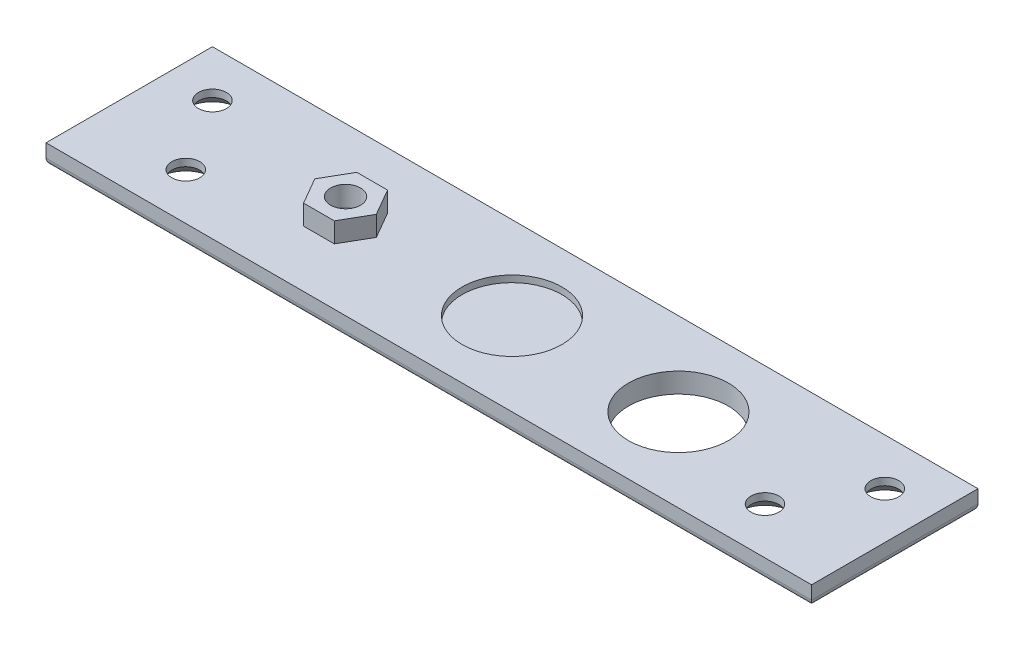
ISO-10303-21;
HEADER;
FILE_DESCRIPTION(('STEP AP214'),'2;1');
FILE_NAME('part.step','',(''),(''),'','','');
FILE_SCHEMA(('AUTOMOTIVE_DESIGN { 1 0 10303 214 1 1 1 1 }'));
ENDSEC;
DATA;
#1=APPLICATION_CONTEXT('core data for automotive mechanical design processes');
#2=APPLICATION_PROTOCOL_DEFINITION('international standard','automotive_design',2000,#1);
#3=PRODUCT_CONTEXT('',#1,'mechanical');
#4=PRODUCT('Part','Part','',(#3));
#5=PRODUCT_RELATED_PRODUCT_CATEGORY('part','',(#4));
#6=PRODUCT_DEFINITION_FORMATION('','',#4);
#7=PRODUCT_DEFINITION_CONTEXT('part definition',#1,'design');
#8=PRODUCT_DEFINITION('design','',#6,#7);
#9=PRODUCT_DEFINITION_SHAPE('','',#8);
#10=(LENGTH_UNIT() NAMED_UNIT(*) SI_UNIT(.MILLI.,.METRE.));
#11=(NAMED_UNIT(*) PLANE_ANGLE_UNIT() SI_UNIT($,.RADIAN.));
#12=(NAMED_UNIT(*) SI_UNIT($,.STERADIAN.) SOLID_ANGLE_UNIT());
#13=UNCERTAINTY_MEASURE_WITH_UNIT(LENGTH_MEASURE(1.E-05),#10,'distance_accuracy_value','');
#14=(GEOMETRIC_REPRESENTATION_CONTEXT(3) GLOBAL_UNCERTAINTY_ASSIGNED_CONTEXT((#13)) GLOBAL_UNIT_ASSIGNED_CONTEXT((#10,
#11,#12)) REPRESENTATION_CONTEXT('',''));
#15=CARTESIAN_POINT('',(0.,0.,0.));
#16=DIRECTION('',(0.,0.,1.));
#17=DIRECTION('',(1.,0.,0.));
#18=AXIS2_PLACEMENT_3D('',#15,#16,#17);
#19=CARTESIAN_POINT('',(0.,4.5,0.));
#20=DIRECTION('',(0.,1.,0.));
#21=DIRECTION('',(0.,0.,1.));
#22=AXIS2_PLACEMENT_3D('',#19,#20,#21);
#23=PLANE('',#22);
#24=DIRECTION('',(1.,0.,0.));
#25=VECTOR('',#24,1.);
#26=CARTESIAN_POINT('',(-27.3094010767585,4.5,3.99999999999999));
#27=LINE('',#26,#25);
#28=CARTESIAN_POINT('',(-27.3094010767585,4.5,3.99999999999999));
#29=VERTEX_POINT('',#28);
#30=CARTESIAN_POINT('',(-22.6905989232415,4.5,4.00000000000002));
#31=VERTEX_POINT('',#30);
#32=EDGE_CURVE('E145',#29,#31,#27,.T.);
#33=ORIENTED_EDGE('',*,*,#32,.T.);
#34=DIRECTION('',(0.500000000000006,0.,-0.866025403784435));
#35=VECTOR('',#34,1.);
#36=CARTESIAN_POINT('',(-22.6905989232415,4.5,4.00000000000002));
#37=LINE('',#36,#35);
#38=CARTESIAN_POINT('',(-20.381197846483,4.5,0.));
#39=VERTEX_POINT('',#38);
#40=EDGE_CURVE('E103',#31,#39,#37,.T.);
#41=ORIENTED_EDGE('',*,*,#40,.T.);
#42=DIRECTION('',(-0.499999999999993,0.,-0.866025403784442));
#43=VECTOR('',#42,1.);
#44=CARTESIAN_POINT('',(-20.381197846483,4.5,0.));
#45=LINE('',#44,#43);
#46=CARTESIAN_POINT('',(-22.6905989232415,4.5,-3.99999999999999));
#47=VERTEX_POINT('',#46);
#48=EDGE_CURVE('E116',#39,#47,#45,.T.);
#49=ORIENTED_EDGE('',*,*,#48,.T.);
#50=DIRECTION('',(-1.,0.,0.));
#51=VECTOR('',#50,1.);
#52=CARTESIAN_POINT('',(-22.6905989232415,4.5,-3.99999999999999));
#53=LINE('',#52,#51);
#54=CARTESIAN_POINT('',(-27.3094010767585,4.5,-4.00000000000002));
#55=VERTEX_POINT('',#54);
#56=EDGE_CURVE('E110',#47,#55,#53,.T.);
#57=ORIENTED_EDGE('',*,*,#56,.T.);
#58=DIRECTION('',(-0.500000000000007,0.,0.866025403784435));
#59=VECTOR('',#58,1.);
#60=CARTESIAN_POINT('',(-27.3094010767585,4.5,-4.00000000000002));
#61=LINE('',#60,#59);
#62=CARTESIAN_POINT('',(-29.618802153517,4.5,0.));
#63=VERTEX_POINT('',#62);
#64=EDGE_CURVE('E114',#55,#63,#61,.T.);
#65=ORIENTED_EDGE('',*,*,#64,.T.);
#66=DIRECTION('',(0.499999999999994,0.,0.866025403784442));
#67=VECTOR('',#66,1.);
#68=CARTESIAN_POINT('',(-29.618802153517,4.5,0.));
#69=LINE('',#68,#67);
#70=EDGE_CURVE('E66',#63,#29,#69,.T.);
#71=ORIENTED_EDGE('',*,*,#70,.T.);
#72=EDGE_LOOP('',(#33,#41,#49,#57,#65,#71));
#73=FACE_BOUND('',#72,.T.);
#74=CARTESIAN_POINT('',(-25.,4.5,0.));
#75=DIRECTION('',(0.,1.,0.));
#76=DIRECTION('',(0.,0.,1.));
#77=AXIS2_PLACEMENT_3D('',#74,#75,#76);
#78=CIRCLE('',#77,2.25);
#79=CARTESIAN_POINT('',(-25.,4.5,2.25));
#80=VERTEX_POINT('',#79);
#81=EDGE_CURVE('E138',#80,#80,#78,.T.);
#82=ORIENTED_EDGE('',*,*,#81,.F.);
#83=EDGE_LOOP('',(#82));
#84=FACE_BOUND('',#83,.T.);
#85=ADVANCED_FACE('F49',(#73,#84),#23,.T.);
#86=CARTESIAN_POINT('',(0.,1.5,0.));
#87=DIRECTION('',(0.,1.,0.));
#88=DIRECTION('',(0.,0.,1.));
#89=AXIS2_PLACEMENT_3D('',#86,#87,#88);
#90=PLANE('',#89);
#91=DIRECTION('',(1.,0.,0.));
#92=VECTOR('',#91,1.);
#93=CARTESIAN_POINT('',(-27.3094010767585,1.5,3.99999999999999));
#94=LINE('',#93,#92);
#95=CARTESIAN_POINT('',(-27.3094010767585,1.5,3.99999999999999));
#96=VERTEX_POINT('',#95);
#97=CARTESIAN_POINT('',(-22.6905989232415,1.5,4.00000000000002));
#98=VERTEX_POINT('',#97);
#99=EDGE_CURVE('E134',#96,#98,#94,.T.);
#100=ORIENTED_EDGE('',*,*,#99,.F.);
#101=DIRECTION('',(0.499999999999994,0.,0.866025403784442));
#102=VECTOR('',#101,1.);
#103=CARTESIAN_POINT('',(-29.618802153517,1.5,0.));
#104=LINE('',#103,#102);
#105=CARTESIAN_POINT('',(-29.618802153517,1.5,0.));
#106=VERTEX_POINT('',#105);
#107=EDGE_CURVE('E95',#106,#96,#104,.T.);
#108=ORIENTED_EDGE('',*,*,#107,.F.);
#109=DIRECTION('',(-0.500000000000007,0.,0.866025403784435));
#110=VECTOR('',#109,1.);
#111=CARTESIAN_POINT('',(-27.3094010767585,1.5,-4.00000000000002));
#112=LINE('',#111,#110);
#113=CARTESIAN_POINT('',(-27.3094010767585,1.5,-4.00000000000002));
#114=VERTEX_POINT('',#113);
#115=EDGE_CURVE('E89',#114,#106,#112,.T.);
#116=ORIENTED_EDGE('',*,*,#115,.F.);
#117=DIRECTION('',(-1.,0.,0.));
#118=VECTOR('',#117,1.);
#119=CARTESIAN_POINT('',(-22.6905989232415,1.5,-3.99999999999999));
#120=LINE('',#119,#118);
#121=CARTESIAN_POINT('',(-22.6905989232415,1.5,-3.99999999999999));
#122=VERTEX_POINT('',#121);
#123=EDGE_CURVE('E124',#122,#114,#120,.T.);
#124=ORIENTED_EDGE('',*,*,#123,.F.);
#125=DIRECTION('',(-0.499999999999993,0.,-0.866025403784442));
#126=VECTOR('',#125,1.);
#127=CARTESIAN_POINT('',(-20.381197846483,1.5,0.));
#128=LINE('',#127,#126);
#129=CARTESIAN_POINT('',(-20.381197846483,1.5,0.));
#130=VERTEX_POINT('',#129);
#131=EDGE_CURVE('E140',#130,#122,#128,.T.);
#132=ORIENTED_EDGE('',*,*,#131,.F.);
#133=DIRECTION('',(0.500000000000006,0.,-0.866025403784435));
#134=VECTOR('',#133,1.);
#135=CARTESIAN_POINT('',(-22.6905989232415,1.5,4.00000000000002));
#136=LINE('',#135,#134);
#137=EDGE_CURVE('E137',#98,#130,#136,.T.);
#138=ORIENTED_EDGE('',*,*,#137,.F.);
#139=EDGE_LOOP('',(#100,#108,#116,#124,#132,#138));
#140=FACE_BOUND('',#139,.T.);
#141=CARTESIAN_POINT('',(-25.,1.5,0.));
#142=DIRECTION('',(0.,1.,0.));
#143=DIRECTION('',(0.,0.,1.));
#144=AXIS2_PLACEMENT_3D('',#141,#142,#143);
#145=CIRCLE('',#144,2.25);
#146=CARTESIAN_POINT('',(-25.,1.5,2.25));
#147=VERTEX_POINT('',#146);
#148=EDGE_CURVE('E256',#147,#147,#145,.T.);
#149=ORIENTED_EDGE('',*,*,#148,.T.);
#150=EDGE_LOOP('',(#149));
#151=FACE_BOUND('',#150,.T.);
#152=ADVANCED_FACE('F154',(#140,#151),#90,.F.);
#153=CARTESIAN_POINT('',(-27.3094010767585,4.5,3.99999999999999));
#154=DIRECTION('',(0.,0.,-1.));
#155=DIRECTION('',(-1.,0.,0.));
#156=AXIS2_PLACEMENT_3D('',#153,#154,#155);
#157=PLANE('',#156);
#158=ORIENTED_EDGE('',*,*,#99,.T.);
#159=DIRECTION('',(0.,-1.,0.));
#160=VECTOR('',#159,1.);
#161=CARTESIAN_POINT('',(-22.6905989232415,4.5,4.00000000000002));
#162=LINE('',#161,#160);
#163=EDGE_CURVE('E12',#31,#98,#162,.T.);
#164=ORIENTED_EDGE('',*,*,#163,.F.);
#165=ORIENTED_EDGE('',*,*,#32,.F.);
#166=DIRECTION('',(0.,-1.,0.));
#167=VECTOR('',#166,1.);
#168=CARTESIAN_POINT('',(-27.3094010767585,4.5,3.99999999999999));
#169=LINE('',#168,#167);
#170=EDGE_CURVE('E130',#29,#96,#169,.T.);
#171=ORIENTED_EDGE('',*,*,#170,.T.);
#172=EDGE_LOOP('',(#158,#164,#165,#171));
#173=FACE_BOUND('',#172,.T.);
#174=ADVANCED_FACE('F51',(#173),#157,.F.);
#175=CARTESIAN_POINT('',(-22.6905989232415,4.5,4.00000000000002));
#176=DIRECTION('',(-0.866025403784435,0.,-0.500000000000006));
#177=DIRECTION('',(-0.500000000000006,0.,0.866025403784436));
#178=AXIS2_PLACEMENT_3D('',#175,#176,#177);
#179=PLANE('',#178);
#180=ORIENTED_EDGE('',*,*,#137,.T.);
#181=DIRECTION('',(0.,-1.,0.));
#182=VECTOR('',#181,1.);
#183=CARTESIAN_POINT('',(-20.381197846483,4.5,0.));
#184=LINE('',#183,#182);
#185=EDGE_CURVE('E58',#39,#130,#184,.T.);
#186=ORIENTED_EDGE('',*,*,#185,.F.);
#187=ORIENTED_EDGE('',*,*,#40,.F.);
#188=ORIENTED_EDGE('',*,*,#163,.T.);
#189=EDGE_LOOP('',(#180,#186,#187,#188));
#190=FACE_BOUND('',#189,.T.);
#191=ADVANCED_FACE('F179',(#190),#179,.F.);
#192=CARTESIAN_POINT('',(-20.381197846483,4.5,0.));
#193=DIRECTION('',(-0.866025403784442,0.,0.499999999999994));
#194=DIRECTION('',(0.499999999999994,0.,0.866025403784442));
#195=AXIS2_PLACEMENT_3D('',#192,#193,#194);
#196=PLANE('',#195);
#197=ORIENTED_EDGE('',*,*,#131,.T.);
#198=DIRECTION('',(0.,-1.,0.));
#199=VECTOR('',#198,1.);
#200=CARTESIAN_POINT('',(-22.6905989232415,4.5,-3.99999999999999));
#201=LINE('',#200,#199);
#202=EDGE_CURVE('E125',#47,#122,#201,.T.);
#203=ORIENTED_EDGE('',*,*,#202,.F.);
#204=ORIENTED_EDGE('',*,*,#48,.F.);
#205=ORIENTED_EDGE('',*,*,#185,.T.);
#206=EDGE_LOOP('',(#197,#203,#204,#205));
#207=FACE_BOUND('',#206,.T.);
#208=ADVANCED_FACE('F151',(#207),#196,.F.);
#209=CARTESIAN_POINT('',(-22.6905989232415,4.5,-3.99999999999999));
#210=DIRECTION('',(0.,0.,1.));
#211=DIRECTION('',(1.,0.,0.));
#212=AXIS2_PLACEMENT_3D('',#209,#210,#211);
#213=PLANE('',#212);
#214=ORIENTED_EDGE('',*,*,#123,.T.);
#215=DIRECTION('',(0.,-1.,0.));
#216=VECTOR('',#215,1.);
#217=CARTESIAN_POINT('',(-27.3094010767585,4.5,-4.00000000000002));
#218=LINE('',#217,#216);
#219=EDGE_CURVE('E121',#55,#114,#218,.T.);
#220=ORIENTED_EDGE('',*,*,#219,.F.);
#221=ORIENTED_EDGE('',*,*,#56,.F.);
#222=ORIENTED_EDGE('',*,*,#202,.T.);
#223=EDGE_LOOP('',(#214,#220,#221,#222));
#224=FACE_BOUND('',#223,.T.);
#225=ADVANCED_FACE('F122',(#224),#213,.F.);
#226=CARTESIAN_POINT('',(-27.3094010767585,4.5,-4.00000000000002));
#227=DIRECTION('',(0.866025403784435,0.,0.500000000000007));
#228=DIRECTION('',(0.500000000000007,0.,-0.866025403784435));
#229=AXIS2_PLACEMENT_3D('',#226,#227,#228);
#230=PLANE('',#229);
#231=ORIENTED_EDGE('',*,*,#115,.T.);
#232=DIRECTION('',(0.,-1.,0.));
#233=VECTOR('',#232,1.);
#234=CARTESIAN_POINT('',(-29.618802153517,4.5,0.));
#235=LINE('',#234,#233);
#236=EDGE_CURVE('E126',#63,#106,#235,.T.);
#237=ORIENTED_EDGE('',*,*,#236,.F.);
#238=ORIENTED_EDGE('',*,*,#64,.F.);
#239=ORIENTED_EDGE('',*,*,#219,.T.);
#240=EDGE_LOOP('',(#231,#237,#238,#239));
#241=FACE_BOUND('',#240,.T.);
#242=ADVANCED_FACE('F128',(#241),#230,.F.);
#243=CARTESIAN_POINT('',(-29.618802153517,4.5,0.));
#244=DIRECTION('',(0.866025403784442,0.,-0.499999999999994));
#245=DIRECTION('',(-0.499999999999994,0.,-0.866025403784442));
#246=AXIS2_PLACEMENT_3D('',#243,#244,#245);
#247=PLANE('',#246);
#248=ORIENTED_EDGE('',*,*,#107,.T.);
#249=ORIENTED_EDGE('',*,*,#170,.F.);
#250=ORIENTED_EDGE('',*,*,#70,.F.);
#251=ORIENTED_EDGE('',*,*,#236,.T.);
#252=EDGE_LOOP('',(#248,#249,#250,#251));
#253=FACE_BOUND('',#252,.T.);
#254=ADVANCED_FACE('F159',(#253),#247,.F.);
#255=CARTESIAN_POINT('',(-25.,4.5,0.));
#256=DIRECTION('',(0.,-1.,0.));
#257=DIRECTION('',(0.,0.,-1.));
#258=AXIS2_PLACEMENT_3D('',#255,#256,#257);
#259=CYLINDRICAL_SURFACE('',#258,2.25);
#260=ORIENTED_EDGE('',*,*,#81,.T.);
#261=EDGE_LOOP('',(#260));
#262=FACE_BOUND('',#261,.T.);
#263=ORIENTED_EDGE('',*,*,#148,.F.);
#264=EDGE_LOOP('',(#263));
#265=FACE_BOUND('',#264,.T.);
#266=ADVANCED_FACE('F161',(#262,#265),#259,.F.);
#267=CLOSED_SHELL('',(#85,#152,#174,#191,#208,#225,#242,#254,#266));
#268=MANIFOLD_SOLID_BREP('B2',#267);
#269=CARTESIAN_POINT('',(57.5,1.5,12.5));
#270=DIRECTION('',(-1.,0.,0.));
#271=DIRECTION('',(0.,0.,1.));
#272=AXIS2_PLACEMENT_3D('',#269,#270,#271);
#273=PLANE('',#272);
#274=DIRECTION('',(0.,-1.,0.));
#275=VECTOR('',#274,1.);
#276=CARTESIAN_POINT('',(57.5,1.5,12.5));
#277=LINE('',#276,#275);
#278=CARTESIAN_POINT('',(57.5,1.5,12.5));
#279=VERTEX_POINT('',#278);
#280=CARTESIAN_POINT('',(57.5,-0.5,12.5));
#281=VERTEX_POINT('',#280);
#282=EDGE_CURVE('E425',#279,#281,#277,.T.);
#283=ORIENTED_EDGE('',*,*,#282,.T.);
#284=DIRECTION('',(0.,0.,-1.));
#285=VECTOR('',#284,1.);
#286=CARTESIAN_POINT('',(57.5,-0.5,-12.5));
#287=LINE('',#286,#285);
#288=CARTESIAN_POINT('',(57.5,-0.5,-12.5));
#289=VERTEX_POINT('',#288);
#290=EDGE_CURVE('E272',#281,#289,#287,.T.);
#291=ORIENTED_EDGE('',*,*,#290,.T.);
#292=DIRECTION('',(0.,-1.,0.));
#293=VECTOR('',#292,1.);
#294=CARTESIAN_POINT('',(57.5,1.5,-12.5));
#295=LINE('',#294,#293);
#296=CARTESIAN_POINT('',(57.5,1.5,-12.5));
#297=VERTEX_POINT('',#296);
#298=EDGE_CURVE('E324',#297,#289,#295,.T.);
#299=ORIENTED_EDGE('',*,*,#298,.F.);
#300=DIRECTION('',(0.,0.,-1.));
#301=VECTOR('',#300,1.);
#302=CARTESIAN_POINT('',(57.5,1.5,12.5));
#303=LINE('',#302,#301);
#304=EDGE_CURVE('E330',#279,#297,#303,.T.);
#305=ORIENTED_EDGE('',*,*,#304,.F.);
#306=EDGE_LOOP('',(#283,#291,#299,#305));
#307=FACE_BOUND('',#306,.T.);
#308=ADVANCED_FACE('F263',(#307),#273,.F.);
#309=CARTESIAN_POINT('',(-57.5,1.5,-12.5));
#310=DIRECTION('',(0.,0.,1.));
#311=DIRECTION('',(1.,0.,0.));
#312=AXIS2_PLACEMENT_3D('',#309,#310,#311);
#313=PLANE('',#312);
#314=ORIENTED_EDGE('',*,*,#298,.T.);
#315=DIRECTION('',(-1.,0.,0.));
#316=VECTOR('',#315,1.);
#317=CARTESIAN_POINT('',(-57.5,-0.5,-12.5));
#318=LINE('',#317,#316);
#319=CARTESIAN_POINT('',(-57.5,-0.5,-12.5));
#320=VERTEX_POINT('',#319);
#321=EDGE_CURVE('E340',#289,#320,#318,.T.);
#322=ORIENTED_EDGE('',*,*,#321,.T.);
#323=DIRECTION('',(0.,-1.,0.));
#324=VECTOR('',#323,1.);
#325=CARTESIAN_POINT('',(-57.5,1.5,-12.5));
#326=LINE('',#325,#324);
#327=CARTESIAN_POINT('',(-57.5,1.5,-12.5));
#328=VERTEX_POINT('',#327);
#329=EDGE_CURVE('E326',#328,#320,#326,.T.);
#330=ORIENTED_EDGE('',*,*,#329,.F.);
#331=DIRECTION('',(-1.,0.,0.));
#332=VECTOR('',#331,1.);
#333=CARTESIAN_POINT('',(-57.5,1.5,-12.5));
#334=LINE('',#333,#332);
#335=EDGE_CURVE('E319',#297,#328,#334,.T.);
#336=ORIENTED_EDGE('',*,*,#335,.F.);
#337=EDGE_LOOP('',(#314,#322,#330,#336));
#338=FACE_BOUND('',#337,.T.);
#339=ADVANCED_FACE('F321',(#338),#313,.F.);
#340=CARTESIAN_POINT('',(-57.5,1.5,12.5));
#341=DIRECTION('',(1.,0.,0.));
#342=DIRECTION('',(0.,0.,-1.));
#343=AXIS2_PLACEMENT_3D('',#340,#341,#342);
#344=PLANE('',#343);
#345=ORIENTED_EDGE('',*,*,#329,.T.);
#346=DIRECTION('',(0.,0.,1.));
#347=VECTOR('',#346,1.);
#348=CARTESIAN_POINT('',(-57.5,-0.5,12.5));
#349=LINE('',#348,#347);
#350=CARTESIAN_POINT('',(-57.5,-0.5,12.5));
#351=VERTEX_POINT('',#350);
#352=EDGE_CURVE('E286',#320,#351,#349,.T.);
#353=ORIENTED_EDGE('',*,*,#352,.T.);
#354=DIRECTION('',(0.,-1.,0.));
#355=VECTOR('',#354,1.);
#356=CARTESIAN_POINT('',(-57.5,1.5,12.5));
#357=LINE('',#356,#355);
#358=CARTESIAN_POINT('',(-57.5,1.5,12.5));
#359=VERTEX_POINT('',#358);
#360=EDGE_CURVE('E344',#359,#351,#357,.T.);
#361=ORIENTED_EDGE('',*,*,#360,.F.);
#362=DIRECTION('',(0.,0.,1.));
#363=VECTOR('',#362,1.);
#364=CARTESIAN_POINT('',(-57.5,1.5,12.5));
#365=LINE('',#364,#363);
#366=EDGE_CURVE('E329',#328,#359,#365,.T.);
#367=ORIENTED_EDGE('',*,*,#366,.F.);
#368=EDGE_LOOP('',(#345,#353,#361,#367));
#369=FACE_BOUND('',#368,.T.);
#370=ADVANCED_FACE('F435',(#369),#344,.F.);
#371=CARTESIAN_POINT('',(-57.5,1.5,12.5));
#372=DIRECTION('',(0.,0.,-1.));
#373=DIRECTION('',(-1.,0.,0.));
#374=AXIS2_PLACEMENT_3D('',#371,#372,#373);
#375=PLANE('',#374);
#376=ORIENTED_EDGE('',*,*,#360,.T.);
#377=DIRECTION('',(1.,0.,0.));
#378=VECTOR('',#377,1.);
#379=CARTESIAN_POINT('',(57.5,-0.5,12.5));
#380=LINE('',#379,#378);
#381=EDGE_CURVE('E47',#351,#281,#380,.T.);
#382=ORIENTED_EDGE('',*,*,#381,.T.);
#383=ORIENTED_EDGE('',*,*,#282,.F.);
#384=DIRECTION('',(1.,0.,0.));
#385=VECTOR('',#384,1.);
#386=CARTESIAN_POINT('',(-57.5,1.5,12.5));
#387=LINE('',#386,#385);
#388=EDGE_CURVE('E335',#359,#279,#387,.T.);
#389=ORIENTED_EDGE('',*,*,#388,.F.);
#390=EDGE_LOOP('',(#376,#382,#383,#389));
#391=FACE_BOUND('',#390,.T.);
#392=ADVANCED_FACE('F426',(#391),#375,.F.);
#393=CARTESIAN_POINT('',(0.,1.5,0.));
#394=DIRECTION('',(0.,-1.,0.));
#395=DIRECTION('',(0.,0.,-1.));
#396=AXIS2_PLACEMENT_3D('',#393,#394,#395);
#397=PLANE('',#396);
#398=CARTESIAN_POINT('',(-25.,1.5,0.));
#399=DIRECTION('',(0.,-1.,0.));
#400=DIRECTION('',(0.,0.,-1.));
#401=AXIS2_PLACEMENT_3D('',#398,#399,#400);
#402=CIRCLE('',#401,2.25);
#403=CARTESIAN_POINT('',(-25.,1.5,-2.25));
#404=VERTEX_POINT('',#403);
#405=EDGE_CURVE('E361',#404,#404,#402,.T.);
#406=ORIENTED_EDGE('',*,*,#405,.T.);
#407=EDGE_LOOP('',(#406));
#408=FACE_BOUND('',#407,.T.);
#409=CARTESIAN_POINT('',(50.5,1.5,-5.5));
#410=DIRECTION('',(0.,-1.,0.));
#411=DIRECTION('',(0.,0.,-1.));
#412=AXIS2_PLACEMENT_3D('',#409,#410,#411);
#413=CIRCLE('',#412,2.1);
#414=CARTESIAN_POINT('',(50.5,1.5,-7.6));
#415=VERTEX_POINT('',#414);
#416=EDGE_CURVE('E378',#415,#415,#413,.T.);
#417=ORIENTED_EDGE('',*,*,#416,.T.);
#418=EDGE_LOOP('',(#417));
#419=FACE_BOUND('',#418,.T.);
#420=CARTESIAN_POINT('',(43.5,1.5,5.5));
#421=DIRECTION('',(0.,-1.,0.));
#422=DIRECTION('',(0.,0.,-1.));
#423=AXIS2_PLACEMENT_3D('',#420,#421,#422);
#424=CIRCLE('',#423,2.1);
#425=CARTESIAN_POINT('',(43.5,1.5,3.4));
#426=VERTEX_POINT('',#425);
#427=EDGE_CURVE('E391',#426,#426,#424,.T.);
#428=ORIENTED_EDGE('',*,*,#427,.T.);
#429=EDGE_LOOP('',(#428));
#430=FACE_BOUND('',#429,.T.);
#431=CARTESIAN_POINT('',(-43.5,1.5,5.5));
#432=DIRECTION('',(0.,-1.,0.));
#433=DIRECTION('',(0.,0.,-1.));
#434=AXIS2_PLACEMENT_3D('',#431,#432,#433);
#435=CIRCLE('',#434,2.1);
#436=CARTESIAN_POINT('',(-43.5,1.5,3.4));
#437=VERTEX_POINT('',#436);
#438=EDGE_CURVE('E400',#437,#437,#435,.T.);
#439=ORIENTED_EDGE('',*,*,#438,.T.);
#440=EDGE_LOOP('',(#439));
#441=FACE_BOUND('',#440,.T.);
#442=CARTESIAN_POINT('',(-50.5,1.5,-5.5));
#443=DIRECTION('',(0.,-1.,0.));
#444=DIRECTION('',(0.,0.,-1.));
#445=AXIS2_PLACEMENT_3D('',#442,#443,#444);
#446=CIRCLE('',#445,2.1);
#447=CARTESIAN_POINT('',(-50.5,1.5,-7.6));
#448=VERTEX_POINT('',#447);
#449=EDGE_CURVE('E409',#448,#448,#446,.T.);
#450=ORIENTED_EDGE('',*,*,#449,.T.);
#451=EDGE_LOOP('',(#450));
#452=FACE_BOUND('',#451,.T.);
#453=CARTESIAN_POINT('',(0.,1.5,0.));
#454=DIRECTION('',(0.,1.,0.));
#455=DIRECTION('',(0.,0.,1.));
#456=AXIS2_PLACEMENT_3D('',#453,#454,#455);
#457=CIRCLE('',#456,7.5);
#458=CARTESIAN_POINT('',(0.,1.5,7.5));
#459=VERTEX_POINT('',#458);
#460=EDGE_CURVE('E412',#459,#459,#457,.T.);
#461=ORIENTED_EDGE('',*,*,#460,.F.);
#462=EDGE_LOOP('',(#461));
#463=FACE_BOUND('',#462,.T.);
#464=CARTESIAN_POINT('',(25.,1.5,0.));
#465=DIRECTION('',(0.,1.,0.));
#466=DIRECTION('',(0.,0.,1.));
#467=AXIS2_PLACEMENT_3D('',#464,#465,#466);
#468=CIRCLE('',#467,7.5);
#469=CARTESIAN_POINT('',(25.,1.5,7.5));
#470=VERTEX_POINT('',#469);
#471=EDGE_CURVE('E416',#470,#470,#468,.T.);
#472=ORIENTED_EDGE('',*,*,#471,.F.);
#473=EDGE_LOOP('',(#472));
#474=FACE_BOUND('',#473,.T.);
#475=ORIENTED_EDGE('',*,*,#304,.T.);
#476=ORIENTED_EDGE('',*,*,#335,.T.);
#477=ORIENTED_EDGE('',*,*,#366,.T.);
#478=ORIENTED_EDGE('',*,*,#388,.T.);
#479=EDGE_LOOP('',(#475,#476,#477,#478));
#480=FACE_BOUND('',#479,.T.);
#481=ADVANCED_FACE('F333',(#408,#419,#430,#441,#452,#463,#474,#480),#397,.F.);
#482=CARTESIAN_POINT('',(0.,-1.5,0.));
#483=DIRECTION('',(0.,-1.,0.));
#484=DIRECTION('',(0.,0.,-1.));
#485=AXIS2_PLACEMENT_3D('',#482,#483,#484);
#486=PLANE('',#485);
#487=CARTESIAN_POINT('',(-25.,-1.5,0.));
#488=DIRECTION('',(0.,-1.,0.));
#489=DIRECTION('',(0.,0.,-1.));
#490=AXIS2_PLACEMENT_3D('',#487,#488,#489);
#491=CIRCLE('',#490,4.48);
#492=CARTESIAN_POINT('',(-25.,-1.5,-4.48));
#493=VERTEX_POINT('',#492);
#494=EDGE_CURVE('E522',#493,#493,#491,.T.);
#495=ORIENTED_EDGE('',*,*,#494,.F.);
#496=EDGE_LOOP('',(#495));
#497=FACE_BOUND('',#496,.T.);
#498=DIRECTION('',(0.,0.,1.));
#499=VECTOR('',#498,1.);
#500=CARTESIAN_POINT('',(-56.5,-1.5,-12.5));
#501=LINE('',#500,#499);
#502=CARTESIAN_POINT('',(-56.5,-1.5,11.5));
#503=VERTEX_POINT('',#502);
#504=CARTESIAN_POINT('',(-56.5,-1.5,-11.5));
#505=VERTEX_POINT('',#504);
#506=EDGE_CURVE('E351',#503,#505,#501,.F.);
#507=ORIENTED_EDGE('',*,*,#506,.T.);
#508=DIRECTION('',(-1.,0.,0.));
#509=VECTOR('',#508,1.);
#510=CARTESIAN_POINT('',(57.5,-1.5,-11.5));
#511=LINE('',#510,#509);
#512=CARTESIAN_POINT('',(56.5,-1.5,-11.5));
#513=VERTEX_POINT('',#512);
#514=EDGE_CURVE('E353',#505,#513,#511,.F.);
#515=ORIENTED_EDGE('',*,*,#514,.T.);
#516=DIRECTION('',(0.,0.,-1.));
#517=VECTOR('',#516,1.);
#518=CARTESIAN_POINT('',(56.5,-1.5,12.5));
#519=LINE('',#518,#517);
#520=CARTESIAN_POINT('',(56.5,-1.5,11.5));
#521=VERTEX_POINT('',#520);
#522=EDGE_CURVE('E349',#513,#521,#519,.F.);
#523=ORIENTED_EDGE('',*,*,#522,.T.);
#524=DIRECTION('',(1.,0.,0.));
#525=VECTOR('',#524,1.);
#526=CARTESIAN_POINT('',(-57.5,-1.5,11.5));
#527=LINE('',#526,#525);
#528=EDGE_CURVE('E342',#521,#503,#527,.F.);
#529=ORIENTED_EDGE('',*,*,#528,.T.);
#530=EDGE_LOOP('',(#507,#515,#523,#529));
#531=FACE_BOUND('',#530,.T.);
#532=CARTESIAN_POINT('',(50.5,-1.5,-5.5));
#533=DIRECTION('',(0.,-1.,0.));
#534=DIRECTION('',(0.,0.,-1.));
#535=AXIS2_PLACEMENT_3D('',#532,#533,#534);
#536=CIRCLE('',#535,4.);
#537=CARTESIAN_POINT('',(50.5,-1.5,-9.5));
#538=VERTEX_POINT('',#537);
#539=EDGE_CURVE('E368',#538,#538,#536,.T.);
#540=ORIENTED_EDGE('',*,*,#539,.F.);
#541=EDGE_LOOP('',(#540));
#542=FACE_BOUND('',#541,.T.);
#543=CARTESIAN_POINT('',(43.5,-1.5,5.5));
#544=DIRECTION('',(0.,-1.,0.));
#545=DIRECTION('',(0.,0.,-1.));
#546=AXIS2_PLACEMENT_3D('',#543,#544,#545);
#547=CIRCLE('',#546,4.);
#548=CARTESIAN_POINT('',(43.5,-1.5,1.5));
#549=VERTEX_POINT('',#548);
#550=EDGE_CURVE('E385',#549,#549,#547,.T.);
#551=ORIENTED_EDGE('',*,*,#550,.F.);
#552=EDGE_LOOP('',(#551));
#553=FACE_BOUND('',#552,.T.);
#554=CARTESIAN_POINT('',(-43.5,-1.5,5.5));
#555=DIRECTION('',(0.,-1.,0.));
#556=DIRECTION('',(0.,0.,-1.));
#557=AXIS2_PLACEMENT_3D('',#554,#555,#556);
#558=CIRCLE('',#557,4.);
#559=CARTESIAN_POINT('',(-43.5,-1.5,1.5));
#560=VERTEX_POINT('',#559);
#561=EDGE_CURVE('E394',#560,#560,#558,.T.);
#562=ORIENTED_EDGE('',*,*,#561,.F.);
#563=EDGE_LOOP('',(#562));
#564=FACE_BOUND('',#563,.T.);
#565=CARTESIAN_POINT('',(-50.5,-1.5,-5.5));
#566=DIRECTION('',(0.,-1.,0.));
#567=DIRECTION('',(0.,0.,-1.));
#568=AXIS2_PLACEMENT_3D('',#565,#566,#567);
#569=CIRCLE('',#568,4.);
#570=CARTESIAN_POINT('',(-50.5,-1.5,-9.5));
#571=VERTEX_POINT('',#570);
#572=EDGE_CURVE('E403',#571,#571,#569,.T.);
#573=ORIENTED_EDGE('',*,*,#572,.F.);
#574=EDGE_LOOP('',(#573));
#575=FACE_BOUND('',#574,.T.);
#576=CARTESIAN_POINT('',(25.,-1.5,0.));
#577=DIRECTION('',(0.,1.,0.));
#578=DIRECTION('',(0.,0.,1.));
#579=AXIS2_PLACEMENT_3D('',#576,#577,#578);
#580=CIRCLE('',#579,7.5);
#581=CARTESIAN_POINT('',(25.,-1.5,7.5));
#582=VERTEX_POINT('',#581);
#583=EDGE_CURVE('E337',#582,#582,#580,.T.);
#584=ORIENTED_EDGE('',*,*,#583,.T.);
#585=EDGE_LOOP('',(#584));
#586=FACE_BOUND('',#585,.T.);
#587=ADVANCED_FACE('F509',(#497,#531,#542,#553,#564,#575,#586),#486,.T.);
#588=CARTESIAN_POINT('',(25.,-1.5,0.));
#589=DIRECTION('',(0.,1.,0.));
#590=DIRECTION('',(0.,0.,1.));
#591=AXIS2_PLACEMENT_3D('',#588,#589,#590);
#592=CYLINDRICAL_SURFACE('',#591,7.5);
#593=ORIENTED_EDGE('',*,*,#583,.F.);
#594=EDGE_LOOP('',(#593));
#595=FACE_BOUND('',#594,.T.);
#596=ORIENTED_EDGE('',*,*,#471,.T.);
#597=EDGE_LOOP('',(#596));
#598=FACE_BOUND('',#597,.T.);
#599=ADVANCED_FACE('F505',(#595,#598),#592,.F.);
#600=CARTESIAN_POINT('',(0.,0.5,0.));
#601=DIRECTION('',(0.,1.,0.));
#602=DIRECTION('',(0.,0.,1.));
#603=AXIS2_PLACEMENT_3D('',#600,#601,#602);
#604=CYLINDRICAL_SURFACE('',#603,7.5);
#605=CARTESIAN_POINT('',(0.,0.5,0.));
#606=DIRECTION('',(0.,1.,0.));
#607=DIRECTION('',(0.,0.,1.));
#608=AXIS2_PLACEMENT_3D('',#605,#606,#607);
#609=CIRCLE('',#608,7.5);
#610=CARTESIAN_POINT('',(0.,0.5,7.5));
#611=VERTEX_POINT('',#610);
#612=EDGE_CURVE('E413',#611,#611,#609,.T.);
#613=ORIENTED_EDGE('',*,*,#612,.F.);
#614=EDGE_LOOP('',(#613));
#615=FACE_BOUND('',#614,.T.);
#616=ORIENTED_EDGE('',*,*,#460,.T.);
#617=EDGE_LOOP('',(#616));
#618=FACE_BOUND('',#617,.T.);
#619=ADVANCED_FACE('F501',(#615,#618),#604,.F.);
#620=CARTESIAN_POINT('',(0.,0.5,0.));
#621=DIRECTION('',(0.,1.,0.));
#622=DIRECTION('',(0.,0.,1.));
#623=AXIS2_PLACEMENT_3D('',#620,#621,#622);
#624=PLANE('',#623);
#625=ORIENTED_EDGE('',*,*,#612,.T.);
#626=EDGE_LOOP('',(#625));
#627=FACE_BOUND('',#626,.T.);
#628=ADVANCED_FACE('F497',(#627),#624,.T.);
#629=CARTESIAN_POINT('',(-50.5,-1.5,-5.5));
#630=DIRECTION('',(0.,-1.,0.));
#631=DIRECTION('',(0.,0.,-1.));
#632=AXIS2_PLACEMENT_3D('',#629,#630,#631);
#633=CYLINDRICAL_SURFACE('',#632,2.1);
#634=ORIENTED_EDGE('',*,*,#449,.F.);
#635=EDGE_LOOP('',(#634));
#636=FACE_BOUND('',#635,.T.);
#637=CARTESIAN_POINT('',(-50.5,0.399999999999999,-5.5));
#638=DIRECTION('',(0.,-1.,0.));
#639=DIRECTION('',(0.,0.,-1.));
#640=AXIS2_PLACEMENT_3D('',#637,#638,#639);
#641=CIRCLE('',#640,2.1);
#642=CARTESIAN_POINT('',(-50.5,0.399999999999999,-7.6));
#643=VERTEX_POINT('',#642);
#644=EDGE_CURVE('E406',#643,#643,#641,.T.);
#645=ORIENTED_EDGE('',*,*,#644,.T.);
#646=EDGE_LOOP('',(#645));
#647=FACE_BOUND('',#646,.T.);
#648=ADVANCED_FACE('F493',(#636,#647),#633,.F.);
#649=CARTESIAN_POINT('',(-50.5,-1.5,-5.5));
#650=DIRECTION('',(0.,-1.,0.));
#651=DIRECTION('',(0.,0.,-1.));
#652=AXIS2_PLACEMENT_3D('',#649,#650,#651);
#653=CONICAL_SURFACE('',#652,4.,0.785398163397448);
#654=ORIENTED_EDGE('',*,*,#644,.F.);
#655=EDGE_LOOP('',(#654));
#656=FACE_BOUND('',#655,.T.);
#657=ORIENTED_EDGE('',*,*,#572,.T.);
#658=EDGE_LOOP('',(#657));
#659=FACE_BOUND('',#658,.T.);
#660=ADVANCED_FACE('F489',(#656,#659),#653,.F.);
#661=CARTESIAN_POINT('',(-43.5,-1.5,5.5));
#662=DIRECTION('',(0.,-1.,0.));
#663=DIRECTION('',(0.,0.,-1.));
#664=AXIS2_PLACEMENT_3D('',#661,#662,#663);
#665=CYLINDRICAL_SURFACE('',#664,2.1);
#666=ORIENTED_EDGE('',*,*,#438,.F.);
#667=EDGE_LOOP('',(#666));
#668=FACE_BOUND('',#667,.T.);
#669=CARTESIAN_POINT('',(-43.5,0.399999999999999,5.5));
#670=DIRECTION('',(0.,-1.,0.));
#671=DIRECTION('',(0.,0.,-1.));
#672=AXIS2_PLACEMENT_3D('',#669,#670,#671);
#673=CIRCLE('',#672,2.1);
#674=CARTESIAN_POINT('',(-43.5,0.399999999999999,3.4));
#675=VERTEX_POINT('',#674);
#676=EDGE_CURVE('E397',#675,#675,#673,.T.);
#677=ORIENTED_EDGE('',*,*,#676,.T.);
#678=EDGE_LOOP('',(#677));
#679=FACE_BOUND('',#678,.T.);
#680=ADVANCED_FACE('F485',(#668,#679),#665,.F.);
#681=CARTESIAN_POINT('',(-43.5,-1.5,5.5));
#682=DIRECTION('',(0.,-1.,0.));
#683=DIRECTION('',(0.,0.,-1.));
#684=AXIS2_PLACEMENT_3D('',#681,#682,#683);
#685=CONICAL_SURFACE('',#684,4.,0.78539816339745);
#686=ORIENTED_EDGE('',*,*,#676,.F.);
#687=EDGE_LOOP('',(#686));
#688=FACE_BOUND('',#687,.T.);
#689=ORIENTED_EDGE('',*,*,#561,.T.);
#690=EDGE_LOOP('',(#689));
#691=FACE_BOUND('',#690,.T.);
#692=ADVANCED_FACE('F481',(#688,#691),#685,.F.);
#693=CARTESIAN_POINT('',(43.5,-1.5,5.5));
#694=DIRECTION('',(0.,-1.,0.));
#695=DIRECTION('',(0.,0.,-1.));
#696=AXIS2_PLACEMENT_3D('',#693,#694,#695);
#697=CYLINDRICAL_SURFACE('',#696,2.1);
#698=ORIENTED_EDGE('',*,*,#427,.F.);
#699=EDGE_LOOP('',(#698));
#700=FACE_BOUND('',#699,.T.);
#701=CARTESIAN_POINT('',(43.5,0.399999999999999,5.5));
#702=DIRECTION('',(0.,-1.,0.));
#703=DIRECTION('',(0.,0.,-1.));
#704=AXIS2_PLACEMENT_3D('',#701,#702,#703);
#705=CIRCLE('',#704,2.1);
#706=CARTESIAN_POINT('',(43.5,0.399999999999999,3.4));
#707=VERTEX_POINT('',#706);
#708=EDGE_CURVE('E388',#707,#707,#705,.T.);
#709=ORIENTED_EDGE('',*,*,#708,.T.);
#710=EDGE_LOOP('',(#709));
#711=FACE_BOUND('',#710,.T.);
#712=ADVANCED_FACE('F477',(#700,#711),#697,.F.);
#713=CARTESIAN_POINT('',(43.5,-1.5,5.5));
#714=DIRECTION('',(0.,-1.,0.));
#715=DIRECTION('',(0.,0.,-1.));
#716=AXIS2_PLACEMENT_3D('',#713,#714,#715);
#717=CONICAL_SURFACE('',#716,4.,0.78539816339745);
#718=ORIENTED_EDGE('',*,*,#708,.F.);
#719=EDGE_LOOP('',(#718));
#720=FACE_BOUND('',#719,.T.);
#721=ORIENTED_EDGE('',*,*,#550,.T.);
#722=EDGE_LOOP('',(#721));
#723=FACE_BOUND('',#722,.T.);
#724=ADVANCED_FACE('F468',(#720,#723),#717,.F.);
#725=CARTESIAN_POINT('',(50.5,-1.5,-5.5));
#726=DIRECTION('',(0.,-1.,0.));
#727=DIRECTION('',(0.,0.,-1.));
#728=AXIS2_PLACEMENT_3D('',#725,#726,#727);
#729=CYLINDRICAL_SURFACE('',#728,2.1);
#730=ORIENTED_EDGE('',*,*,#416,.F.);
#731=EDGE_LOOP('',(#730));
#732=FACE_BOUND('',#731,.T.);
#733=CARTESIAN_POINT('',(50.5,0.399999999999999,-5.5));
#734=DIRECTION('',(0.,-1.,0.));
#735=DIRECTION('',(0.,0.,-1.));
#736=AXIS2_PLACEMENT_3D('',#733,#734,#735);
#737=CIRCLE('',#736,2.1);
#738=CARTESIAN_POINT('',(50.5,0.399999999999999,-7.6));
#739=VERTEX_POINT('',#738);
#740=EDGE_CURVE('E373',#739,#739,#737,.T.);
#741=ORIENTED_EDGE('',*,*,#740,.T.);
#742=EDGE_LOOP('',(#741));
#743=FACE_BOUND('',#742,.T.);
#744=ADVANCED_FACE('F463',(#732,#743),#729,.F.);
#745=CARTESIAN_POINT('',(50.5,-1.5,-5.5));
#746=DIRECTION('',(0.,-1.,0.));
#747=DIRECTION('',(0.,0.,-1.));
#748=AXIS2_PLACEMENT_3D('',#745,#746,#747);
#749=CONICAL_SURFACE('',#748,4.,0.785398163397448);
#750=ORIENTED_EDGE('',*,*,#740,.F.);
#751=EDGE_LOOP('',(#750));
#752=FACE_BOUND('',#751,.T.);
#753=ORIENTED_EDGE('',*,*,#539,.T.);
#754=EDGE_LOOP('',(#753));
#755=FACE_BOUND('',#754,.T.);
#756=ADVANCED_FACE('F459',(#752,#755),#749,.F.);
#757=CARTESIAN_POINT('',(-57.5,-0.5,11.5));
#758=DIRECTION('',(-1.,0.,0.));
#759=DIRECTION('',(0.,0.,1.));
#760=AXIS2_PLACEMENT_3D('',#757,#758,#759);
#761=CYLINDRICAL_SURFACE('',#760,1.);
#762=CARTESIAN_POINT('',(-56.5,-0.5,11.5));
#763=DIRECTION('',(-0.707106781186547,0.,-0.707106781186547));
#764=DIRECTION('',(-0.707106781186547,0.,0.707106781186547));
#765=AXIS2_PLACEMENT_3D('',#762,#763,#764);
#766=ELLIPSE('',#765,1.41421356237309,1.);
#767=EDGE_CURVE('E362',#503,#351,#766,.T.);
#768=ORIENTED_EDGE('',*,*,#767,.F.);
#769=ORIENTED_EDGE('',*,*,#528,.F.);
#770=CARTESIAN_POINT('',(56.5,-0.5,11.5));
#771=DIRECTION('',(-0.707106781186547,0.,0.707106781186547));
#772=DIRECTION('',(-0.707106781186547,0.,-0.707106781186547));
#773=AXIS2_PLACEMENT_3D('',#770,#771,#772);
#774=ELLIPSE('',#773,1.41421356237309,1.);
#775=EDGE_CURVE('E267',#281,#521,#774,.F.);
#776=ORIENTED_EDGE('',*,*,#775,.F.);
#777=ORIENTED_EDGE('',*,*,#381,.F.);
#778=EDGE_LOOP('',(#768,#769,#776,#777));
#779=FACE_BOUND('',#778,.T.);
#780=ADVANCED_FACE('F265',(#779),#761,.T.);
#781=CARTESIAN_POINT('',(56.5,-0.5,12.5));
#782=DIRECTION('',(0.,0.,1.));
#783=DIRECTION('',(1.,0.,0.));
#784=AXIS2_PLACEMENT_3D('',#781,#782,#783);
#785=CYLINDRICAL_SURFACE('',#784,1.);
#786=ORIENTED_EDGE('',*,*,#775,.T.);
#787=ORIENTED_EDGE('',*,*,#522,.F.);
#788=CARTESIAN_POINT('',(56.5,-0.5,-11.5));
#789=DIRECTION('',(0.707106781186547,0.,0.707106781186547));
#790=DIRECTION('',(-0.707106781186547,0.,0.707106781186547));
#791=AXIS2_PLACEMENT_3D('',#788,#789,#790);
#792=ELLIPSE('',#791,1.41421356237309,1.);
#793=EDGE_CURVE('E360',#289,#513,#792,.F.);
#794=ORIENTED_EDGE('',*,*,#793,.F.);
#795=ORIENTED_EDGE('',*,*,#290,.F.);
#796=EDGE_LOOP('',(#786,#787,#794,#795));
#797=FACE_BOUND('',#796,.T.);
#798=ADVANCED_FACE('F429',(#797),#785,.T.);
#799=CARTESIAN_POINT('',(-56.5,-0.5,12.5));
#800=DIRECTION('',(0.,0.,-1.));
#801=DIRECTION('',(-1.,0.,0.));
#802=AXIS2_PLACEMENT_3D('',#799,#800,#801);
#803=CYLINDRICAL_SURFACE('',#802,1.);
#804=ORIENTED_EDGE('',*,*,#767,.T.);
#805=ORIENTED_EDGE('',*,*,#352,.F.);
#806=CARTESIAN_POINT('',(-56.5,-0.5,-11.5));
#807=DIRECTION('',(0.707106781186547,0.,-0.707106781186547));
#808=DIRECTION('',(-0.707106781186547,0.,-0.707106781186547));
#809=AXIS2_PLACEMENT_3D('',#806,#807,#808);
#810=ELLIPSE('',#809,1.41421356237309,1.);
#811=EDGE_CURVE('E358',#505,#320,#810,.T.);
#812=ORIENTED_EDGE('',*,*,#811,.F.);
#813=ORIENTED_EDGE('',*,*,#506,.F.);
#814=EDGE_LOOP('',(#804,#805,#812,#813));
#815=FACE_BOUND('',#814,.T.);
#816=ADVANCED_FACE('F453',(#815),#803,.T.);
#817=CARTESIAN_POINT('',(-57.5,-0.5,-11.5));
#818=DIRECTION('',(1.,0.,0.));
#819=DIRECTION('',(0.,0.,-1.));
#820=AXIS2_PLACEMENT_3D('',#817,#818,#819);
#821=CYLINDRICAL_SURFACE('',#820,1.);
#822=ORIENTED_EDGE('',*,*,#793,.T.);
#823=ORIENTED_EDGE('',*,*,#514,.F.);
#824=ORIENTED_EDGE('',*,*,#811,.T.);
#825=ORIENTED_EDGE('',*,*,#321,.F.);
#826=EDGE_LOOP('',(#822,#823,#824,#825));
#827=FACE_BOUND('',#826,.T.);
#828=ADVANCED_FACE('F433',(#827),#821,.T.);
#829=CARTESIAN_POINT('',(-25.,-1.5,0.));
#830=DIRECTION('',(0.,-1.,0.));
#831=DIRECTION('',(0.,0.,-1.));
#832=AXIS2_PLACEMENT_3D('',#829,#830,#831);
#833=CYLINDRICAL_SURFACE('',#832,2.25);
#834=ORIENTED_EDGE('',*,*,#405,.F.);
#835=EDGE_LOOP('',(#834));
#836=FACE_BOUND('',#835,.T.);
#837=CARTESIAN_POINT('',(-25.,0.73,0.));
#838=DIRECTION('',(0.,-1.,0.));
#839=DIRECTION('',(0.,0.,-1.));
#840=AXIS2_PLACEMENT_3D('',#837,#838,#839);
#841=CIRCLE('',#840,2.25);
#842=CARTESIAN_POINT('',(-25.,0.73,-2.25));
#843=VERTEX_POINT('',#842);
#844=EDGE_CURVE('E539',#843,#843,#841,.T.);
#845=ORIENTED_EDGE('',*,*,#844,.T.);
#846=EDGE_LOOP('',(#845));
#847=FACE_BOUND('',#846,.T.);
#848=ADVANCED_FACE('F452',(#836,#847),#833,.F.);
#849=CARTESIAN_POINT('',(-25.,-1.5,0.));
#850=DIRECTION('',(0.,-1.,0.));
#851=DIRECTION('',(0.,0.,-1.));
#852=AXIS2_PLACEMENT_3D('',#849,#850,#851);
#853=CONICAL_SURFACE('',#852,4.48,0.785398163397448);
#854=ORIENTED_EDGE('',*,*,#844,.F.);
#855=EDGE_LOOP('',(#854));
#856=FACE_BOUND('',#855,.T.);
#857=ORIENTED_EDGE('',*,*,#494,.T.);
#858=EDGE_LOOP('',(#857));
#859=FACE_BOUND('',#858,.T.);
#860=ADVANCED_FACE('F549',(#856,#859),#853,.F.);
#861=CLOSED_SHELL('',(#308,#339,#370,#392,#481,#587,#599,#619,#628,#648,#660,#680,#692,#712,
#724,#744,#756,#780,#798,#816,#828,#848,#860));
#862=MANIFOLD_SOLID_BREP('B6',#861);
#863=ADVANCED_BREP_SHAPE_REPRESENTATION('',(#18,#268,#862),#14);
#864=SHAPE_DEFINITION_REPRESENTATION(#9,#863);
ENDSEC;
END-ISO-10303-21;
